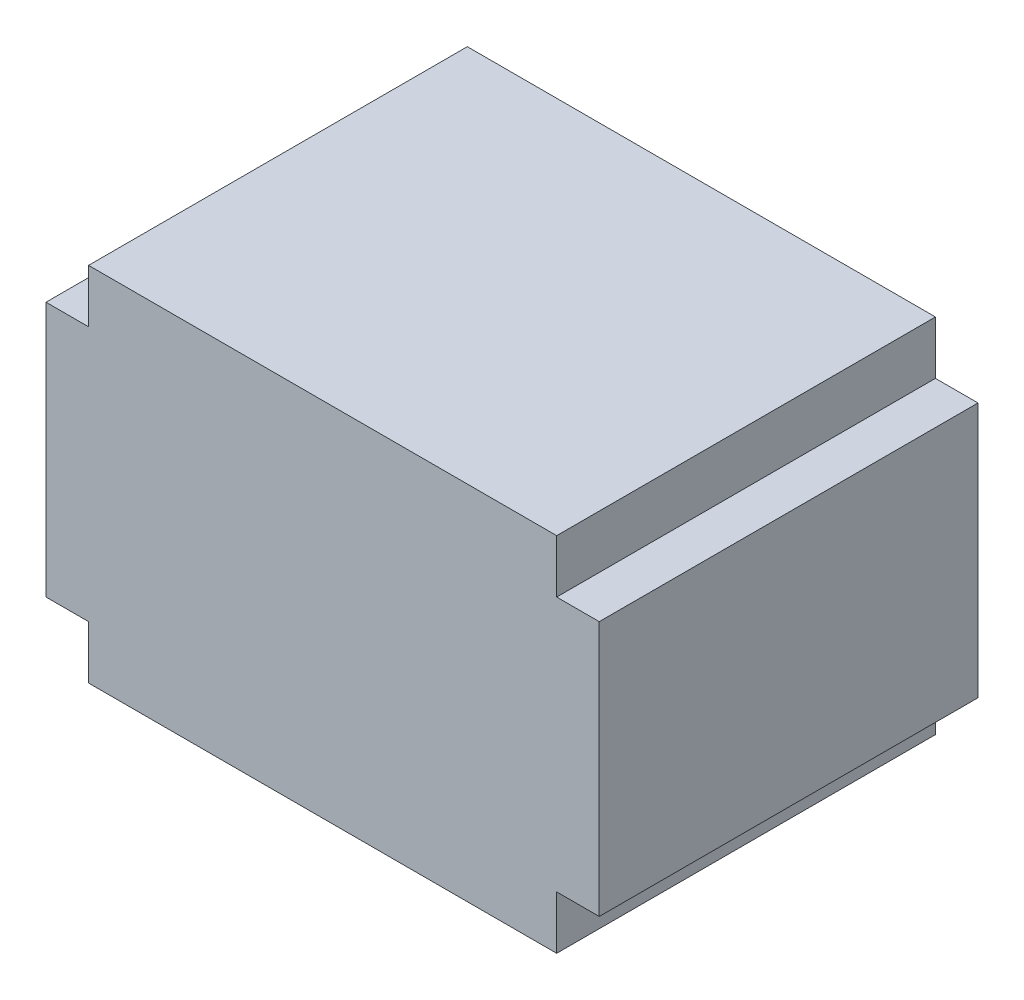
ISO-10303-21;
HEADER;
FILE_DESCRIPTION(('STEP AP214'),'2;1');
FILE_NAME('part.step','',(''),(''),'','','');
FILE_SCHEMA(('AUTOMOTIVE_DESIGN { 1 0 10303 214 1 1 1 1 }'));
ENDSEC;
DATA;
#1=APPLICATION_CONTEXT('core data for automotive mechanical design processes');
#2=APPLICATION_PROTOCOL_DEFINITION('international standard','automotive_design',2000,#1);
#3=PRODUCT_CONTEXT('',#1,'mechanical');
#4=PRODUCT('Part','Part','',(#3));
#5=PRODUCT_RELATED_PRODUCT_CATEGORY('part','',(#4));
#6=PRODUCT_DEFINITION_FORMATION('','',#4);
#7=PRODUCT_DEFINITION_CONTEXT('part definition',#1,'design');
#8=PRODUCT_DEFINITION('design','',#6,#7);
#9=PRODUCT_DEFINITION_SHAPE('','',#8);
#10=(LENGTH_UNIT() NAMED_UNIT(*) SI_UNIT(.MILLI.,.METRE.));
#11=(NAMED_UNIT(*) PLANE_ANGLE_UNIT() SI_UNIT($,.RADIAN.));
#12=(NAMED_UNIT(*) SI_UNIT($,.STERADIAN.) SOLID_ANGLE_UNIT());
#13=UNCERTAINTY_MEASURE_WITH_UNIT(LENGTH_MEASURE(1.E-05),#10,'distance_accuracy_value','');
#14=(GEOMETRIC_REPRESENTATION_CONTEXT(3) GLOBAL_UNCERTAINTY_ASSIGNED_CONTEXT((#13)) GLOBAL_UNIT_ASSIGNED_CONTEXT((#10,
#11,#12)) REPRESENTATION_CONTEXT('',''));
#15=CARTESIAN_POINT('',(0.,0.,0.));
#16=DIRECTION('',(0.,0.,1.));
#17=DIRECTION('',(1.,0.,0.));
#18=AXIS2_PLACEMENT_3D('',#15,#16,#17);
#19=CARTESIAN_POINT('',(1.1,-0.85,1.78));
#20=DIRECTION('',(0.,1.,0.));
#21=DIRECTION('',(0.,0.,1.));
#22=AXIS2_PLACEMENT_3D('',#19,#20,#21);
#23=PLANE('',#22);
#24=DIRECTION('',(1.,0.,0.));
#25=VECTOR('',#24,1.);
#26=CARTESIAN_POINT('',(1.1,-0.85,0.));
#27=LINE('',#26,#25);
#28=CARTESIAN_POINT('',(-1.1,-0.85,0.));
#29=VERTEX_POINT('',#28);
#30=CARTESIAN_POINT('',(1.1,-0.85,0.));
#31=VERTEX_POINT('',#30);
#32=EDGE_CURVE('E154',#29,#31,#27,.T.);
#33=ORIENTED_EDGE('',*,*,#32,.T.);
#34=DIRECTION('',(0.,0.,-1.));
#35=VECTOR('',#34,1.);
#36=CARTESIAN_POINT('',(1.1,-0.85,1.78));
#37=LINE('',#36,#35);
#38=CARTESIAN_POINT('',(1.1,-0.85,1.78));
#39=VERTEX_POINT('',#38);
#40=EDGE_CURVE('E11',#39,#31,#37,.T.);
#41=ORIENTED_EDGE('',*,*,#40,.F.);
#42=DIRECTION('',(1.,0.,0.));
#43=VECTOR('',#42,1.);
#44=CARTESIAN_POINT('',(1.1,-0.85,1.78));
#45=LINE('',#44,#43);
#46=CARTESIAN_POINT('',(-1.1,-0.85,1.78));
#47=VERTEX_POINT('',#46);
#48=EDGE_CURVE('E176',#47,#39,#45,.T.);
#49=ORIENTED_EDGE('',*,*,#48,.F.);
#50=DIRECTION('',(0.,0.,-1.));
#51=VECTOR('',#50,1.);
#52=CARTESIAN_POINT('',(-1.1,-0.85,1.78));
#53=LINE('',#52,#51);
#54=EDGE_CURVE('E150',#47,#29,#53,.T.);
#55=ORIENTED_EDGE('',*,*,#54,.T.);
#56=EDGE_LOOP('',(#33,#41,#49,#55));
#57=FACE_BOUND('',#56,.T.);
#58=ADVANCED_FACE('F34',(#57),#23,.F.);
#59=CARTESIAN_POINT('',(1.1,-0.6,1.78));
#60=DIRECTION('',(-1.,0.,0.));
#61=DIRECTION('',(0.,0.,1.));
#62=AXIS2_PLACEMENT_3D('',#59,#60,#61);
#63=PLANE('',#62);
#64=DIRECTION('',(0.,1.,0.));
#65=VECTOR('',#64,1.);
#66=CARTESIAN_POINT('',(1.1,-0.6,0.));
#67=LINE('',#66,#65);
#68=CARTESIAN_POINT('',(1.1,-0.6,0.));
#69=VERTEX_POINT('',#68);
#70=EDGE_CURVE('E157',#31,#69,#67,.T.);
#71=ORIENTED_EDGE('',*,*,#70,.T.);
#72=DIRECTION('',(0.,0.,-1.));
#73=VECTOR('',#72,1.);
#74=CARTESIAN_POINT('',(1.1,-0.6,1.78));
#75=LINE('',#74,#73);
#76=CARTESIAN_POINT('',(1.1,-0.6,1.78));
#77=VERTEX_POINT('',#76);
#78=EDGE_CURVE('E42',#77,#69,#75,.T.);
#79=ORIENTED_EDGE('',*,*,#78,.F.);
#80=DIRECTION('',(0.,1.,0.));
#81=VECTOR('',#80,1.);
#82=CARTESIAN_POINT('',(1.1,-0.6,1.78));
#83=LINE('',#82,#81);
#84=EDGE_CURVE('E105',#39,#77,#83,.T.);
#85=ORIENTED_EDGE('',*,*,#84,.F.);
#86=ORIENTED_EDGE('',*,*,#40,.T.);
#87=EDGE_LOOP('',(#71,#79,#85,#86));
#88=FACE_BOUND('',#87,.T.);
#89=ADVANCED_FACE('F254',(#88),#63,.F.);
#90=CARTESIAN_POINT('',(1.3,-0.6,1.78));
#91=DIRECTION('',(0.,1.,0.));
#92=DIRECTION('',(0.,0.,1.));
#93=AXIS2_PLACEMENT_3D('',#90,#91,#92);
#94=PLANE('',#93);
#95=DIRECTION('',(1.,0.,0.));
#96=VECTOR('',#95,1.);
#97=CARTESIAN_POINT('',(1.3,-0.6,0.));
#98=LINE('',#97,#96);
#99=CARTESIAN_POINT('',(1.3,-0.6,0.));
#100=VERTEX_POINT('',#99);
#101=EDGE_CURVE('E159',#69,#100,#98,.T.);
#102=ORIENTED_EDGE('',*,*,#101,.T.);
#103=DIRECTION('',(0.,0.,-1.));
#104=VECTOR('',#103,1.);
#105=CARTESIAN_POINT('',(1.3,-0.6,1.78));
#106=LINE('',#105,#104);
#107=CARTESIAN_POINT('',(1.3,-0.6,1.78));
#108=VERTEX_POINT('',#107);
#109=EDGE_CURVE('E195',#108,#100,#106,.T.);
#110=ORIENTED_EDGE('',*,*,#109,.F.);
#111=DIRECTION('',(1.,0.,0.));
#112=VECTOR('',#111,1.);
#113=CARTESIAN_POINT('',(1.3,-0.6,1.78));
#114=LINE('',#113,#112);
#115=EDGE_CURVE('E203',#77,#108,#114,.T.);
#116=ORIENTED_EDGE('',*,*,#115,.F.);
#117=ORIENTED_EDGE('',*,*,#78,.T.);
#118=EDGE_LOOP('',(#102,#110,#116,#117));
#119=FACE_BOUND('',#118,.T.);
#120=ADVANCED_FACE('F201',(#119),#94,.F.);
#121=CARTESIAN_POINT('',(1.3,0.6,1.78));
#122=DIRECTION('',(-1.,0.,0.));
#123=DIRECTION('',(0.,0.,1.));
#124=AXIS2_PLACEMENT_3D('',#121,#122,#123);
#125=PLANE('',#124);
#126=DIRECTION('',(0.,1.,0.));
#127=VECTOR('',#126,1.);
#128=CARTESIAN_POINT('',(1.3,0.6,0.));
#129=LINE('',#128,#127);
#130=CARTESIAN_POINT('',(1.3,0.6,0.));
#131=VERTEX_POINT('',#130);
#132=EDGE_CURVE('E161',#100,#131,#129,.T.);
#133=ORIENTED_EDGE('',*,*,#132,.T.);
#134=DIRECTION('',(0.,0.,-1.));
#135=VECTOR('',#134,1.);
#136=CARTESIAN_POINT('',(1.3,0.6,1.78));
#137=LINE('',#136,#135);
#138=CARTESIAN_POINT('',(1.3,0.6,1.78));
#139=VERTEX_POINT('',#138);
#140=EDGE_CURVE('E192',#139,#131,#137,.T.);
#141=ORIENTED_EDGE('',*,*,#140,.F.);
#142=DIRECTION('',(0.,1.,0.));
#143=VECTOR('',#142,1.);
#144=CARTESIAN_POINT('',(1.3,0.6,1.78));
#145=LINE('',#144,#143);
#146=EDGE_CURVE('E221',#108,#139,#145,.T.);
#147=ORIENTED_EDGE('',*,*,#146,.F.);
#148=ORIENTED_EDGE('',*,*,#109,.T.);
#149=EDGE_LOOP('',(#133,#141,#147,#148));
#150=FACE_BOUND('',#149,.T.);
#151=ADVANCED_FACE('F212',(#150),#125,.F.);
#152=CARTESIAN_POINT('',(1.1,0.6,1.78));
#153=DIRECTION('',(0.,-1.,0.));
#154=DIRECTION('',(0.,0.,-1.));
#155=AXIS2_PLACEMENT_3D('',#152,#153,#154);
#156=PLANE('',#155);
#157=DIRECTION('',(-1.,0.,0.));
#158=VECTOR('',#157,1.);
#159=CARTESIAN_POINT('',(1.1,0.6,0.));
#160=LINE('',#159,#158);
#161=CARTESIAN_POINT('',(1.1,0.6,0.));
#162=VERTEX_POINT('',#161);
#163=EDGE_CURVE('E163',#131,#162,#160,.T.);
#164=ORIENTED_EDGE('',*,*,#163,.T.);
#165=DIRECTION('',(0.,0.,-1.));
#166=VECTOR('',#165,1.);
#167=CARTESIAN_POINT('',(1.1,0.6,1.78));
#168=LINE('',#167,#166);
#169=CARTESIAN_POINT('',(1.1,0.6,1.78));
#170=VERTEX_POINT('',#169);
#171=EDGE_CURVE('E189',#170,#162,#168,.T.);
#172=ORIENTED_EDGE('',*,*,#171,.F.);
#173=DIRECTION('',(-1.,0.,0.));
#174=VECTOR('',#173,1.);
#175=CARTESIAN_POINT('',(1.1,0.6,1.78));
#176=LINE('',#175,#174);
#177=EDGE_CURVE('E218',#139,#170,#176,.T.);
#178=ORIENTED_EDGE('',*,*,#177,.F.);
#179=ORIENTED_EDGE('',*,*,#140,.T.);
#180=EDGE_LOOP('',(#164,#172,#178,#179));
#181=FACE_BOUND('',#180,.T.);
#182=ADVANCED_FACE('F216',(#181),#156,.F.);
#183=CARTESIAN_POINT('',(1.1,0.85,1.78));
#184=DIRECTION('',(-1.,0.,0.));
#185=DIRECTION('',(0.,0.,1.));
#186=AXIS2_PLACEMENT_3D('',#183,#184,#185);
#187=PLANE('',#186);
#188=DIRECTION('',(0.,1.,0.));
#189=VECTOR('',#188,1.);
#190=CARTESIAN_POINT('',(1.1,0.85,0.));
#191=LINE('',#190,#189);
#192=CARTESIAN_POINT('',(1.1,0.85,0.));
#193=VERTEX_POINT('',#192);
#194=EDGE_CURVE('E165',#162,#193,#191,.T.);
#195=ORIENTED_EDGE('',*,*,#194,.T.);
#196=DIRECTION('',(0.,0.,-1.));
#197=VECTOR('',#196,1.);
#198=CARTESIAN_POINT('',(1.1,0.85,1.78));
#199=LINE('',#198,#197);
#200=CARTESIAN_POINT('',(1.1,0.85,1.78));
#201=VERTEX_POINT('',#200);
#202=EDGE_CURVE('E186',#201,#193,#199,.T.);
#203=ORIENTED_EDGE('',*,*,#202,.F.);
#204=DIRECTION('',(0.,1.,0.));
#205=VECTOR('',#204,1.);
#206=CARTESIAN_POINT('',(1.1,0.85,1.78));
#207=LINE('',#206,#205);
#208=EDGE_CURVE('E220',#170,#201,#207,.T.);
#209=ORIENTED_EDGE('',*,*,#208,.F.);
#210=ORIENTED_EDGE('',*,*,#171,.T.);
#211=EDGE_LOOP('',(#195,#203,#209,#210));
#212=FACE_BOUND('',#211,.T.);
#213=ADVANCED_FACE('F267',(#212),#187,.F.);
#214=CARTESIAN_POINT('',(-1.1,0.85,1.78));
#215=DIRECTION('',(0.,-1.,0.));
#216=DIRECTION('',(0.,0.,-1.));
#217=AXIS2_PLACEMENT_3D('',#214,#215,#216);
#218=PLANE('',#217);
#219=DIRECTION('',(-1.,0.,0.));
#220=VECTOR('',#219,1.);
#221=CARTESIAN_POINT('',(-1.1,0.85,0.));
#222=LINE('',#221,#220);
#223=CARTESIAN_POINT('',(-1.1,0.85,0.));
#224=VERTEX_POINT('',#223);
#225=EDGE_CURVE('E167',#193,#224,#222,.T.);
#226=ORIENTED_EDGE('',*,*,#225,.T.);
#227=DIRECTION('',(0.,0.,-1.));
#228=VECTOR('',#227,1.);
#229=CARTESIAN_POINT('',(-1.1,0.85,1.78));
#230=LINE('',#229,#228);
#231=CARTESIAN_POINT('',(-1.1,0.85,1.78));
#232=VERTEX_POINT('',#231);
#233=EDGE_CURVE('E183',#232,#224,#230,.T.);
#234=ORIENTED_EDGE('',*,*,#233,.F.);
#235=DIRECTION('',(-1.,0.,0.));
#236=VECTOR('',#235,1.);
#237=CARTESIAN_POINT('',(-1.1,0.85,1.78));
#238=LINE('',#237,#236);
#239=EDGE_CURVE('E223',#201,#232,#238,.T.);
#240=ORIENTED_EDGE('',*,*,#239,.F.);
#241=ORIENTED_EDGE('',*,*,#202,.T.);
#242=EDGE_LOOP('',(#226,#234,#240,#241));
#243=FACE_BOUND('',#242,.T.);
#244=ADVANCED_FACE('F270',(#243),#218,.F.);
#245=CARTESIAN_POINT('',(-1.1,0.6,1.78));
#246=DIRECTION('',(1.,0.,0.));
#247=DIRECTION('',(0.,0.,-1.));
#248=AXIS2_PLACEMENT_3D('',#245,#246,#247);
#249=PLANE('',#248);
#250=DIRECTION('',(0.,-1.,0.));
#251=VECTOR('',#250,1.);
#252=CARTESIAN_POINT('',(-1.1,0.6,0.));
#253=LINE('',#252,#251);
#254=CARTESIAN_POINT('',(-1.1,0.6,0.));
#255=VERTEX_POINT('',#254);
#256=EDGE_CURVE('E169',#224,#255,#253,.T.);
#257=ORIENTED_EDGE('',*,*,#256,.T.);
#258=DIRECTION('',(0.,0.,-1.));
#259=VECTOR('',#258,1.);
#260=CARTESIAN_POINT('',(-1.1,0.6,1.78));
#261=LINE('',#260,#259);
#262=CARTESIAN_POINT('',(-1.1,0.6,1.78));
#263=VERTEX_POINT('',#262);
#264=EDGE_CURVE('E180',#263,#255,#261,.T.);
#265=ORIENTED_EDGE('',*,*,#264,.F.);
#266=DIRECTION('',(0.,-1.,0.));
#267=VECTOR('',#266,1.);
#268=CARTESIAN_POINT('',(-1.1,0.6,1.78));
#269=LINE('',#268,#267);
#270=EDGE_CURVE('E229',#232,#263,#269,.T.);
#271=ORIENTED_EDGE('',*,*,#270,.F.);
#272=ORIENTED_EDGE('',*,*,#233,.T.);
#273=EDGE_LOOP('',(#257,#265,#271,#272));
#274=FACE_BOUND('',#273,.T.);
#275=ADVANCED_FACE('F235',(#274),#249,.F.);
#276=CARTESIAN_POINT('',(-1.3,0.6,1.78));
#277=DIRECTION('',(0.,-1.,0.));
#278=DIRECTION('',(0.,0.,-1.));
#279=AXIS2_PLACEMENT_3D('',#276,#277,#278);
#280=PLANE('',#279);
#281=DIRECTION('',(-1.,0.,0.));
#282=VECTOR('',#281,1.);
#283=CARTESIAN_POINT('',(-1.3,0.6,0.));
#284=LINE('',#283,#282);
#285=CARTESIAN_POINT('',(-1.3,0.6,0.));
#286=VERTEX_POINT('',#285);
#287=EDGE_CURVE('E171',#255,#286,#284,.T.);
#288=ORIENTED_EDGE('',*,*,#287,.T.);
#289=DIRECTION('',(0.,0.,-1.));
#290=VECTOR('',#289,1.);
#291=CARTESIAN_POINT('',(-1.3,0.6,1.78));
#292=LINE('',#291,#290);
#293=CARTESIAN_POINT('',(-1.3,0.6,1.78));
#294=VERTEX_POINT('',#293);
#295=EDGE_CURVE('E145',#294,#286,#292,.T.);
#296=ORIENTED_EDGE('',*,*,#295,.F.);
#297=DIRECTION('',(-1.,0.,0.));
#298=VECTOR('',#297,1.);
#299=CARTESIAN_POINT('',(-1.3,0.6,1.78));
#300=LINE('',#299,#298);
#301=EDGE_CURVE('E136',#263,#294,#300,.T.);
#302=ORIENTED_EDGE('',*,*,#301,.F.);
#303=ORIENTED_EDGE('',*,*,#264,.T.);
#304=EDGE_LOOP('',(#288,#296,#302,#303));
#305=FACE_BOUND('',#304,.T.);
#306=ADVANCED_FACE('F239',(#305),#280,.F.);
#307=CARTESIAN_POINT('',(-1.3,-0.6,1.78));
#308=DIRECTION('',(1.,0.,0.));
#309=DIRECTION('',(0.,0.,-1.));
#310=AXIS2_PLACEMENT_3D('',#307,#308,#309);
#311=PLANE('',#310);
#312=DIRECTION('',(0.,-1.,0.));
#313=VECTOR('',#312,1.);
#314=CARTESIAN_POINT('',(-1.3,-0.6,0.));
#315=LINE('',#314,#313);
#316=CARTESIAN_POINT('',(-1.3,-0.6,0.));
#317=VERTEX_POINT('',#316);
#318=EDGE_CURVE('E144',#286,#317,#315,.T.);
#319=ORIENTED_EDGE('',*,*,#318,.T.);
#320=DIRECTION('',(0.,0.,-1.));
#321=VECTOR('',#320,1.);
#322=CARTESIAN_POINT('',(-1.3,-0.6,1.78));
#323=LINE('',#322,#321);
#324=CARTESIAN_POINT('',(-1.3,-0.6,1.78));
#325=VERTEX_POINT('',#324);
#326=EDGE_CURVE('E141',#325,#317,#323,.T.);
#327=ORIENTED_EDGE('',*,*,#326,.F.);
#328=DIRECTION('',(0.,-1.,0.));
#329=VECTOR('',#328,1.);
#330=CARTESIAN_POINT('',(-1.3,-0.6,1.78));
#331=LINE('',#330,#329);
#332=EDGE_CURVE('E130',#294,#325,#331,.T.);
#333=ORIENTED_EDGE('',*,*,#332,.F.);
#334=ORIENTED_EDGE('',*,*,#295,.T.);
#335=EDGE_LOOP('',(#319,#327,#333,#334));
#336=FACE_BOUND('',#335,.T.);
#337=ADVANCED_FACE('F142',(#336),#311,.F.);
#338=CARTESIAN_POINT('',(-1.1,-0.6,1.78));
#339=DIRECTION('',(0.,1.,0.));
#340=DIRECTION('',(0.,0.,1.));
#341=AXIS2_PLACEMENT_3D('',#338,#339,#340);
#342=PLANE('',#341);
#343=DIRECTION('',(1.,0.,0.));
#344=VECTOR('',#343,1.);
#345=CARTESIAN_POINT('',(-1.1,-0.6,0.));
#346=LINE('',#345,#344);
#347=CARTESIAN_POINT('',(-1.1,-0.6,0.));
#348=VERTEX_POINT('',#347);
#349=EDGE_CURVE('E91',#317,#348,#346,.T.);
#350=ORIENTED_EDGE('',*,*,#349,.T.);
#351=DIRECTION('',(0.,0.,-1.));
#352=VECTOR('',#351,1.);
#353=CARTESIAN_POINT('',(-1.1,-0.6,1.78));
#354=LINE('',#353,#352);
#355=CARTESIAN_POINT('',(-1.1,-0.6,1.78));
#356=VERTEX_POINT('',#355);
#357=EDGE_CURVE('E146',#356,#348,#354,.T.);
#358=ORIENTED_EDGE('',*,*,#357,.F.);
#359=DIRECTION('',(1.,0.,0.));
#360=VECTOR('',#359,1.);
#361=CARTESIAN_POINT('',(-1.1,-0.6,1.78));
#362=LINE('',#361,#360);
#363=EDGE_CURVE('E134',#325,#356,#362,.T.);
#364=ORIENTED_EDGE('',*,*,#363,.F.);
#365=ORIENTED_EDGE('',*,*,#326,.T.);
#366=EDGE_LOOP('',(#350,#358,#364,#365));
#367=FACE_BOUND('',#366,.T.);
#368=ADVANCED_FACE('F148',(#367),#342,.F.);
#369=CARTESIAN_POINT('',(-1.1,-0.85,1.78));
#370=DIRECTION('',(1.,0.,0.));
#371=DIRECTION('',(0.,0.,-1.));
#372=AXIS2_PLACEMENT_3D('',#369,#370,#371);
#373=PLANE('',#372);
#374=DIRECTION('',(0.,-1.,0.));
#375=VECTOR('',#374,1.);
#376=CARTESIAN_POINT('',(-1.1,-0.85,0.));
#377=LINE('',#376,#375);
#378=EDGE_CURVE('E97',#348,#29,#377,.T.);
#379=ORIENTED_EDGE('',*,*,#378,.T.);
#380=ORIENTED_EDGE('',*,*,#54,.F.);
#381=DIRECTION('',(0.,-1.,0.));
#382=VECTOR('',#381,1.);
#383=CARTESIAN_POINT('',(-1.1,-0.85,1.78));
#384=LINE('',#383,#382);
#385=EDGE_CURVE('E50',#356,#47,#384,.T.);
#386=ORIENTED_EDGE('',*,*,#385,.F.);
#387=ORIENTED_EDGE('',*,*,#357,.T.);
#388=EDGE_LOOP('',(#379,#380,#386,#387));
#389=FACE_BOUND('',#388,.T.);
#390=ADVANCED_FACE('F243',(#389),#373,.F.);
#391=CARTESIAN_POINT('',(0.,0.,1.78));
#392=DIRECTION('',(0.,0.,-1.));
#393=DIRECTION('',(-1.,0.,0.));
#394=AXIS2_PLACEMENT_3D('',#391,#392,#393);
#395=PLANE('',#394);
#396=ORIENTED_EDGE('',*,*,#48,.T.);
#397=ORIENTED_EDGE('',*,*,#84,.T.);
#398=ORIENTED_EDGE('',*,*,#115,.T.);
#399=ORIENTED_EDGE('',*,*,#146,.T.);
#400=ORIENTED_EDGE('',*,*,#177,.T.);
#401=ORIENTED_EDGE('',*,*,#208,.T.);
#402=ORIENTED_EDGE('',*,*,#239,.T.);
#403=ORIENTED_EDGE('',*,*,#270,.T.);
#404=ORIENTED_EDGE('',*,*,#301,.T.);
#405=ORIENTED_EDGE('',*,*,#332,.T.);
#406=ORIENTED_EDGE('',*,*,#363,.T.);
#407=ORIENTED_EDGE('',*,*,#385,.T.);
#408=EDGE_LOOP('',(#396,#397,#398,#399,#400,#401,#402,#403,#404,#405,#406,#407));
#409=FACE_BOUND('',#408,.T.);
#410=ADVANCED_FACE('F132',(#409),#395,.F.);
#411=CARTESIAN_POINT('',(0.,0.,0.));
#412=DIRECTION('',(0.,0.,-1.));
#413=DIRECTION('',(-1.,0.,0.));
#414=AXIS2_PLACEMENT_3D('',#411,#412,#413);
#415=PLANE('',#414);
#416=ORIENTED_EDGE('',*,*,#32,.F.);
#417=ORIENTED_EDGE('',*,*,#378,.F.);
#418=ORIENTED_EDGE('',*,*,#349,.F.);
#419=ORIENTED_EDGE('',*,*,#318,.F.);
#420=ORIENTED_EDGE('',*,*,#287,.F.);
#421=ORIENTED_EDGE('',*,*,#256,.F.);
#422=ORIENTED_EDGE('',*,*,#225,.F.);
#423=ORIENTED_EDGE('',*,*,#194,.F.);
#424=ORIENTED_EDGE('',*,*,#163,.F.);
#425=ORIENTED_EDGE('',*,*,#132,.F.);
#426=ORIENTED_EDGE('',*,*,#101,.F.);
#427=ORIENTED_EDGE('',*,*,#70,.F.);
#428=EDGE_LOOP('',(#416,#417,#418,#419,#420,#421,#422,#423,#424,#425,#426,#427));
#429=FACE_BOUND('',#428,.T.);
#430=ADVANCED_FACE('F207',(#429),#415,.T.);
#431=CLOSED_SHELL('',(#58,#89,#120,#151,#182,#213,#244,#275,#306,#337,#368,#390,#410,#430));
#432=MANIFOLD_SOLID_BREP('B2',#431);
#433=ADVANCED_BREP_SHAPE_REPRESENTATION('',(#18,#432),#14);
#434=SHAPE_DEFINITION_REPRESENTATION(#9,#433);
ENDSEC;
END-ISO-10303-21;
